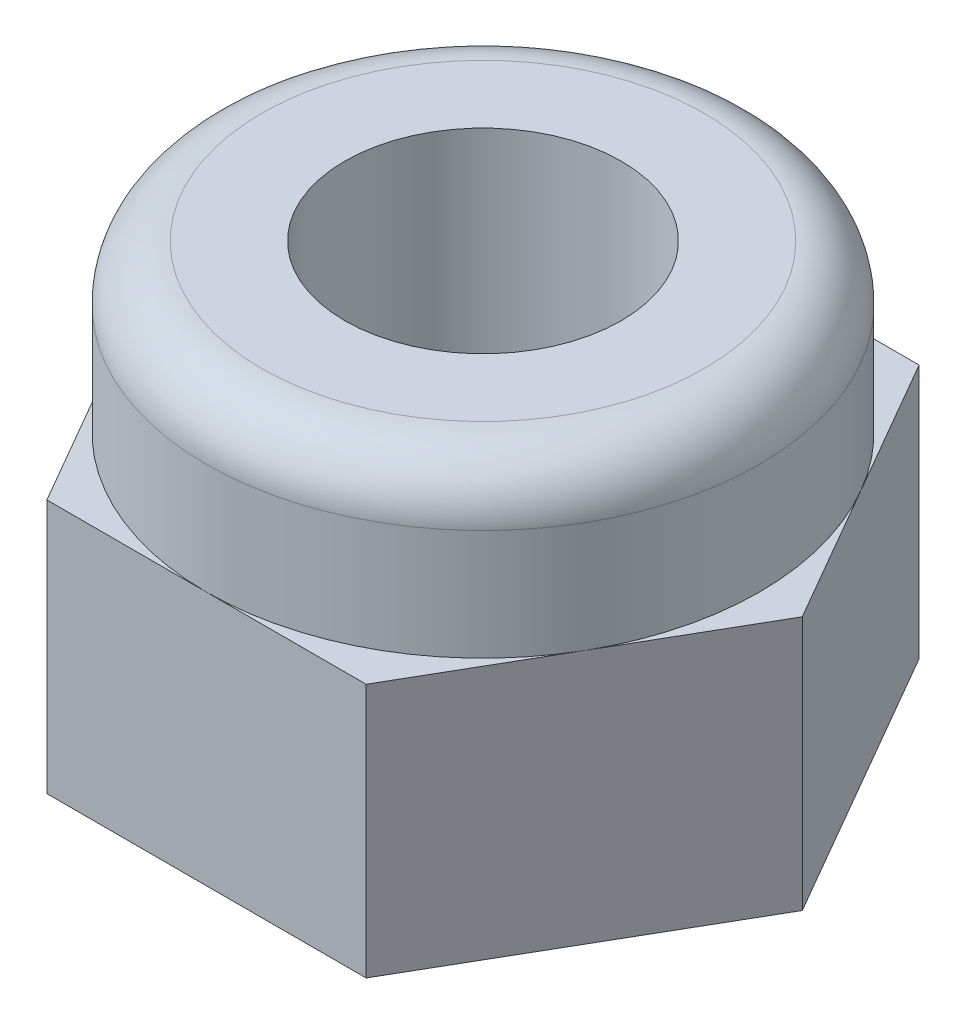
ISO-10303-21;
HEADER;
FILE_DESCRIPTION(('STEP AP214'),'2;1');
FILE_NAME('part.step','',(''),(''),'','','');
FILE_SCHEMA(('AUTOMOTIVE_DESIGN { 1 0 10303 214 1 1 1 1 }'));
ENDSEC;
DATA;
#1=APPLICATION_CONTEXT('core data for automotive mechanical design processes');
#2=APPLICATION_PROTOCOL_DEFINITION('international standard','automotive_design',2000,#1);
#3=PRODUCT_CONTEXT('',#1,'mechanical');
#4=PRODUCT('Part','Part','',(#3));
#5=PRODUCT_RELATED_PRODUCT_CATEGORY('part','',(#4));
#6=PRODUCT_DEFINITION_FORMATION('','',#4);
#7=PRODUCT_DEFINITION_CONTEXT('part definition',#1,'design');
#8=PRODUCT_DEFINITION('design','',#6,#7);
#9=PRODUCT_DEFINITION_SHAPE('','',#8);
#10=(LENGTH_UNIT() NAMED_UNIT(*) SI_UNIT(.MILLI.,.METRE.));
#11=(NAMED_UNIT(*) PLANE_ANGLE_UNIT() SI_UNIT($,.RADIAN.));
#12=(NAMED_UNIT(*) SI_UNIT($,.STERADIAN.) SOLID_ANGLE_UNIT());
#13=UNCERTAINTY_MEASURE_WITH_UNIT(LENGTH_MEASURE(1.E-05),#10,'distance_accuracy_value','');
#14=(GEOMETRIC_REPRESENTATION_CONTEXT(3) GLOBAL_UNCERTAINTY_ASSIGNED_CONTEXT((#13)) GLOBAL_UNIT_ASSIGNED_CONTEXT((#10,
#11,#12)) REPRESENTATION_CONTEXT('',''));
#15=CARTESIAN_POINT('',(0.,0.,0.));
#16=DIRECTION('',(0.,0.,1.));
#17=DIRECTION('',(1.,0.,0.));
#18=AXIS2_PLACEMENT_3D('',#15,#16,#17);
#19=CARTESIAN_POINT('',(0.,2.3,0.));
#20=DIRECTION('',(0.,1.,0.));
#21=DIRECTION('',(0.,0.,1.));
#22=AXIS2_PLACEMENT_3D('',#19,#20,#21);
#23=PLANE('',#22);
#24=CARTESIAN_POINT('',(0.,2.3,0.));
#25=DIRECTION('',(0.,1.,0.));
#26=DIRECTION('',(0.,0.,1.));
#27=AXIS2_PLACEMENT_3D('',#24,#25,#26);
#28=CIRCLE('',#27,2.5);
#29=CARTESIAN_POINT('',(0.,2.3,2.5));
#30=VERTEX_POINT('',#29);
#31=CARTESIAN_POINT('',(2.1650635094611,2.3,1.25));
#32=VERTEX_POINT('',#31);
#33=EDGE_CURVE('E123',#30,#32,#28,.T.);
#34=ORIENTED_EDGE('',*,*,#33,.F.);
#35=DIRECTION('',(1.,0.,0.));
#36=VECTOR('',#35,1.);
#37=CARTESIAN_POINT('',(-1.44337567297406,2.3,2.5));
#38=LINE('',#37,#36);
#39=CARTESIAN_POINT('',(1.44337567297407,2.3,2.5));
#40=VERTEX_POINT('',#39);
#41=EDGE_CURVE('E112',#30,#40,#38,.T.);
#42=ORIENTED_EDGE('',*,*,#41,.T.);
#43=DIRECTION('',(0.5,0.,-0.866025403784439));
#44=VECTOR('',#43,1.);
#45=CARTESIAN_POINT('',(1.44337567297407,2.3,2.5));
#46=LINE('',#45,#44);
#47=EDGE_CURVE('E124',#40,#32,#46,.T.);
#48=ORIENTED_EDGE('',*,*,#47,.T.);
#49=EDGE_LOOP('',(#34,#42,#48));
#50=FACE_BOUND('',#49,.T.);
#51=ADVANCED_FACE('F34',(#50),#23,.T.);
#52=CARTESIAN_POINT('',(2.1650635094611,2.3,-1.25));
#53=VERTEX_POINT('',#52);
#54=EDGE_CURVE('E130',#32,#53,#28,.T.);
#55=ORIENTED_EDGE('',*,*,#54,.F.);
#56=CARTESIAN_POINT('',(2.88675134594813,2.3,0.));
#57=VERTEX_POINT('',#56);
#58=EDGE_CURVE('E145',#32,#57,#46,.T.);
#59=ORIENTED_EDGE('',*,*,#58,.T.);
#60=DIRECTION('',(-0.5,0.,-0.866025403784439));
#61=VECTOR('',#60,1.);
#62=CARTESIAN_POINT('',(2.88675134594813,2.3,0.));
#63=LINE('',#62,#61);
#64=EDGE_CURVE('E146',#57,#53,#63,.T.);
#65=ORIENTED_EDGE('',*,*,#64,.T.);
#66=EDGE_LOOP('',(#55,#59,#65));
#67=FACE_BOUND('',#66,.T.);
#68=ADVANCED_FACE('F224',(#67),#23,.T.);
#69=CARTESIAN_POINT('',(0.,2.3,-2.5));
#70=VERTEX_POINT('',#69);
#71=EDGE_CURVE('E183',#53,#70,#28,.T.);
#72=ORIENTED_EDGE('',*,*,#71,.F.);
#73=CARTESIAN_POINT('',(1.44337567297406,2.3,-2.5));
#74=VERTEX_POINT('',#73);
#75=EDGE_CURVE('E144',#53,#74,#63,.T.);
#76=ORIENTED_EDGE('',*,*,#75,.T.);
#77=DIRECTION('',(-1.,0.,0.));
#78=VECTOR('',#77,1.);
#79=CARTESIAN_POINT('',(1.44337567297406,2.3,-2.5));
#80=LINE('',#79,#78);
#81=EDGE_CURVE('E150',#74,#70,#80,.T.);
#82=ORIENTED_EDGE('',*,*,#81,.T.);
#83=EDGE_LOOP('',(#72,#76,#82));
#84=FACE_BOUND('',#83,.T.);
#85=ADVANCED_FACE('F194',(#84),#23,.T.);
#86=CARTESIAN_POINT('',(-2.1650635094611,2.3,-1.25));
#87=VERTEX_POINT('',#86);
#88=EDGE_CURVE('E134',#70,#87,#28,.T.);
#89=ORIENTED_EDGE('',*,*,#88,.F.);
#90=CARTESIAN_POINT('',(-1.44337567297406,2.3,-2.5));
#91=VERTEX_POINT('',#90);
#92=EDGE_CURVE('E149',#70,#91,#80,.T.);
#93=ORIENTED_EDGE('',*,*,#92,.T.);
#94=DIRECTION('',(-0.5,0.,0.866025403784439));
#95=VECTOR('',#94,1.);
#96=CARTESIAN_POINT('',(-1.44337567297406,2.3,-2.5));
#97=LINE('',#96,#95);
#98=EDGE_CURVE('E154',#91,#87,#97,.T.);
#99=ORIENTED_EDGE('',*,*,#98,.T.);
#100=EDGE_LOOP('',(#89,#93,#99));
#101=FACE_BOUND('',#100,.T.);
#102=ADVANCED_FACE('F187',(#101),#23,.T.);
#103=CARTESIAN_POINT('',(-2.1650635094611,2.3,1.25));
#104=VERTEX_POINT('',#103);
#105=EDGE_CURVE('E57',#87,#104,#28,.T.);
#106=ORIENTED_EDGE('',*,*,#105,.F.);
#107=CARTESIAN_POINT('',(-2.88675134594813,2.3,0.));
#108=VERTEX_POINT('',#107);
#109=EDGE_CURVE('E153',#87,#108,#97,.T.);
#110=ORIENTED_EDGE('',*,*,#109,.T.);
#111=DIRECTION('',(0.5,0.,0.866025403784439));
#112=VECTOR('',#111,1.);
#113=CARTESIAN_POINT('',(-2.88675134594813,2.3,0.));
#114=LINE('',#113,#112);
#115=EDGE_CURVE('E121',#108,#104,#114,.T.);
#116=ORIENTED_EDGE('',*,*,#115,.T.);
#117=EDGE_LOOP('',(#106,#110,#116));
#118=FACE_BOUND('',#117,.T.);
#119=ADVANCED_FACE('F214',(#118),#23,.T.);
#120=EDGE_CURVE('E49',#104,#30,#28,.T.);
#121=ORIENTED_EDGE('',*,*,#120,.F.);
#122=CARTESIAN_POINT('',(-1.44337567297406,2.3,2.5));
#123=VERTEX_POINT('',#122);
#124=EDGE_CURVE('E107',#104,#123,#114,.T.);
#125=ORIENTED_EDGE('',*,*,#124,.T.);
#126=EDGE_CURVE('E104',#123,#30,#38,.T.);
#127=ORIENTED_EDGE('',*,*,#126,.T.);
#128=EDGE_LOOP('',(#121,#125,#127));
#129=FACE_BOUND('',#128,.T.);
#130=ADVANCED_FACE('F106',(#129),#23,.T.);
#131=CARTESIAN_POINT('',(0.,0.,0.));
#132=DIRECTION('',(0.,1.,0.));
#133=DIRECTION('',(0.,0.,1.));
#134=AXIS2_PLACEMENT_3D('',#131,#132,#133);
#135=PLANE('',#134);
#136=DIRECTION('',(0.5,0.,-0.866025403784439));
#137=VECTOR('',#136,1.);
#138=CARTESIAN_POINT('',(1.44337567297407,0.,2.5));
#139=LINE('',#138,#137);
#140=CARTESIAN_POINT('',(1.44337567297407,0.,2.5));
#141=VERTEX_POINT('',#140);
#142=CARTESIAN_POINT('',(2.88675134594813,0.,0.));
#143=VERTEX_POINT('',#142);
#144=EDGE_CURVE('E142',#141,#143,#139,.T.);
#145=ORIENTED_EDGE('',*,*,#144,.F.);
#146=DIRECTION('',(1.,0.,0.));
#147=VECTOR('',#146,1.);
#148=CARTESIAN_POINT('',(-1.44337567297406,0.,2.5));
#149=LINE('',#148,#147);
#150=CARTESIAN_POINT('',(-1.44337567297406,0.,2.5));
#151=VERTEX_POINT('',#150);
#152=EDGE_CURVE('E168',#151,#141,#149,.T.);
#153=ORIENTED_EDGE('',*,*,#152,.F.);
#154=DIRECTION('',(0.5,0.,0.866025403784439));
#155=VECTOR('',#154,1.);
#156=CARTESIAN_POINT('',(-2.88675134594813,0.,0.));
#157=LINE('',#156,#155);
#158=CARTESIAN_POINT('',(-2.88675134594813,0.,0.));
#159=VERTEX_POINT('',#158);
#160=EDGE_CURVE('E166',#159,#151,#157,.T.);
#161=ORIENTED_EDGE('',*,*,#160,.F.);
#162=DIRECTION('',(-0.5,0.,0.866025403784439));
#163=VECTOR('',#162,1.);
#164=CARTESIAN_POINT('',(-1.44337567297406,0.,-2.5));
#165=LINE('',#164,#163);
#166=CARTESIAN_POINT('',(-1.44337567297406,0.,-2.5));
#167=VERTEX_POINT('',#166);
#168=EDGE_CURVE('E164',#167,#159,#165,.T.);
#169=ORIENTED_EDGE('',*,*,#168,.F.);
#170=DIRECTION('',(-1.,0.,0.));
#171=VECTOR('',#170,1.);
#172=CARTESIAN_POINT('',(1.44337567297406,0.,-2.5));
#173=LINE('',#172,#171);
#174=CARTESIAN_POINT('',(1.44337567297406,0.,-2.5));
#175=VERTEX_POINT('',#174);
#176=EDGE_CURVE('E162',#175,#167,#173,.T.);
#177=ORIENTED_EDGE('',*,*,#176,.F.);
#178=DIRECTION('',(-0.5,0.,-0.866025403784439));
#179=VECTOR('',#178,1.);
#180=CARTESIAN_POINT('',(2.88675134594813,0.,0.));
#181=LINE('',#180,#179);
#182=EDGE_CURVE('E160',#143,#175,#181,.T.);
#183=ORIENTED_EDGE('',*,*,#182,.F.);
#184=EDGE_LOOP('',(#145,#153,#161,#169,#177,#183));
#185=FACE_BOUND('',#184,.T.);
#186=CARTESIAN_POINT('',(0.,0.,0.));
#187=DIRECTION('',(0.,1.,0.));
#188=DIRECTION('',(0.,0.,1.));
#189=AXIS2_PLACEMENT_3D('',#186,#187,#188);
#190=CIRCLE('',#189,1.25);
#191=CARTESIAN_POINT('',(0.,0.,1.25));
#192=VERTEX_POINT('',#191);
#193=EDGE_CURVE('E127',#192,#192,#190,.T.);
#194=ORIENTED_EDGE('',*,*,#193,.T.);
#195=EDGE_LOOP('',(#194));
#196=FACE_BOUND('',#195,.T.);
#197=ADVANCED_FACE('F204',(#185,#196),#135,.F.);
#198=CARTESIAN_POINT('',(1.44337567297407,2.3,2.5));
#199=DIRECTION('',(-0.866025403784439,0.,-0.5));
#200=DIRECTION('',(-0.5,0.,0.866025403784439));
#201=AXIS2_PLACEMENT_3D('',#198,#199,#200);
#202=PLANE('',#201);
#203=ORIENTED_EDGE('',*,*,#144,.T.);
#204=DIRECTION('',(0.,-1.,0.));
#205=VECTOR('',#204,1.);
#206=CARTESIAN_POINT('',(2.88675134594813,2.3,0.));
#207=LINE('',#206,#205);
#208=EDGE_CURVE('E133',#57,#143,#207,.T.);
#209=ORIENTED_EDGE('',*,*,#208,.F.);
#210=ORIENTED_EDGE('',*,*,#58,.F.);
#211=ORIENTED_EDGE('',*,*,#47,.F.);
#212=DIRECTION('',(0.,-1.,0.));
#213=VECTOR('',#212,1.);
#214=CARTESIAN_POINT('',(1.44337567297407,2.3,2.5));
#215=LINE('',#214,#213);
#216=EDGE_CURVE('E111',#40,#141,#215,.T.);
#217=ORIENTED_EDGE('',*,*,#216,.T.);
#218=EDGE_LOOP('',(#203,#209,#210,#211,#217));
#219=FACE_BOUND('',#218,.T.);
#220=ADVANCED_FACE('F235',(#219),#202,.F.);
#221=CARTESIAN_POINT('',(2.88675134594813,2.3,0.));
#222=DIRECTION('',(-0.866025403784439,0.,0.5));
#223=DIRECTION('',(0.5,0.,0.866025403784438));
#224=AXIS2_PLACEMENT_3D('',#221,#222,#223);
#225=PLANE('',#224);
#226=ORIENTED_EDGE('',*,*,#182,.T.);
#227=DIRECTION('',(0.,-1.,0.));
#228=VECTOR('',#227,1.);
#229=CARTESIAN_POINT('',(1.44337567297406,2.3,-2.5));
#230=LINE('',#229,#228);
#231=EDGE_CURVE('E136',#74,#175,#230,.T.);
#232=ORIENTED_EDGE('',*,*,#231,.F.);
#233=ORIENTED_EDGE('',*,*,#75,.F.);
#234=ORIENTED_EDGE('',*,*,#64,.F.);
#235=ORIENTED_EDGE('',*,*,#208,.T.);
#236=EDGE_LOOP('',(#226,#232,#233,#234,#235));
#237=FACE_BOUND('',#236,.T.);
#238=ADVANCED_FACE('F199',(#237),#225,.F.);
#239=CARTESIAN_POINT('',(1.44337567297406,2.3,-2.5));
#240=DIRECTION('',(0.,0.,1.));
#241=DIRECTION('',(1.,0.,0.));
#242=AXIS2_PLACEMENT_3D('',#239,#240,#241);
#243=PLANE('',#242);
#244=ORIENTED_EDGE('',*,*,#176,.T.);
#245=DIRECTION('',(0.,-1.,0.));
#246=VECTOR('',#245,1.);
#247=CARTESIAN_POINT('',(-1.44337567297406,2.3,-2.5));
#248=LINE('',#247,#246);
#249=EDGE_CURVE('E176',#91,#167,#248,.T.);
#250=ORIENTED_EDGE('',*,*,#249,.F.);
#251=ORIENTED_EDGE('',*,*,#92,.F.);
#252=ORIENTED_EDGE('',*,*,#81,.F.);
#253=ORIENTED_EDGE('',*,*,#231,.T.);
#254=EDGE_LOOP('',(#244,#250,#251,#252,#253));
#255=FACE_BOUND('',#254,.T.);
#256=ADVANCED_FACE('F192',(#255),#243,.F.);
#257=CARTESIAN_POINT('',(-1.44337567297406,2.3,-2.5));
#258=DIRECTION('',(0.866025403784439,0.,0.5));
#259=DIRECTION('',(0.5,0.,-0.866025403784439));
#260=AXIS2_PLACEMENT_3D('',#257,#258,#259);
#261=PLANE('',#260);
#262=ORIENTED_EDGE('',*,*,#168,.T.);
#263=DIRECTION('',(0.,-1.,0.));
#264=VECTOR('',#263,1.);
#265=CARTESIAN_POINT('',(-2.88675134594813,2.3,0.));
#266=LINE('',#265,#264);
#267=EDGE_CURVE('E173',#108,#159,#266,.T.);
#268=ORIENTED_EDGE('',*,*,#267,.F.);
#269=ORIENTED_EDGE('',*,*,#109,.F.);
#270=ORIENTED_EDGE('',*,*,#98,.F.);
#271=ORIENTED_EDGE('',*,*,#249,.T.);
#272=EDGE_LOOP('',(#262,#268,#269,#270,#271));
#273=FACE_BOUND('',#272,.T.);
#274=ADVANCED_FACE('F210',(#273),#261,.F.);
#275=CARTESIAN_POINT('',(-2.88675134594813,2.3,0.));
#276=DIRECTION('',(0.866025403784439,0.,-0.5));
#277=DIRECTION('',(-0.5,0.,-0.866025403784439));
#278=AXIS2_PLACEMENT_3D('',#275,#276,#277);
#279=PLANE('',#278);
#280=ORIENTED_EDGE('',*,*,#160,.T.);
#281=DIRECTION('',(0.,-1.,0.));
#282=VECTOR('',#281,1.);
#283=CARTESIAN_POINT('',(-1.44337567297406,2.3,2.5));
#284=LINE('',#283,#282);
#285=EDGE_CURVE('E171',#123,#151,#284,.T.);
#286=ORIENTED_EDGE('',*,*,#285,.F.);
#287=ORIENTED_EDGE('',*,*,#124,.F.);
#288=ORIENTED_EDGE('',*,*,#115,.F.);
#289=ORIENTED_EDGE('',*,*,#267,.T.);
#290=EDGE_LOOP('',(#280,#286,#287,#288,#289));
#291=FACE_BOUND('',#290,.T.);
#292=ADVANCED_FACE('F213',(#291),#279,.F.);
#293=CARTESIAN_POINT('',(-1.44337567297406,2.3,2.5));
#294=DIRECTION('',(0.,0.,-1.));
#295=DIRECTION('',(-1.,0.,0.));
#296=AXIS2_PLACEMENT_3D('',#293,#294,#295);
#297=PLANE('',#296);
#298=ORIENTED_EDGE('',*,*,#152,.T.);
#299=ORIENTED_EDGE('',*,*,#216,.F.);
#300=ORIENTED_EDGE('',*,*,#41,.F.);
#301=ORIENTED_EDGE('',*,*,#126,.F.);
#302=ORIENTED_EDGE('',*,*,#285,.T.);
#303=EDGE_LOOP('',(#298,#299,#300,#301,#302));
#304=FACE_BOUND('',#303,.T.);
#305=ADVANCED_FACE('F116',(#304),#297,.F.);
#306=CARTESIAN_POINT('',(0.,2.3,0.));
#307=DIRECTION('',(0.,-1.,0.));
#308=DIRECTION('',(0.,0.,-1.));
#309=AXIS2_PLACEMENT_3D('',#306,#307,#308);
#310=CYLINDRICAL_SURFACE('',#309,1.25);
#311=ORIENTED_EDGE('',*,*,#193,.F.);
#312=EDGE_LOOP('',(#311));
#313=FACE_BOUND('',#312,.T.);
#314=CARTESIAN_POINT('',(0.,3.8,0.));
#315=DIRECTION('',(0.,1.,0.));
#316=DIRECTION('',(0.,0.,1.));
#317=AXIS2_PLACEMENT_3D('',#314,#315,#316);
#318=CIRCLE('',#317,1.25);
#319=CARTESIAN_POINT('',(0.,3.8,1.25));
#320=VERTEX_POINT('',#319);
#321=EDGE_CURVE('E128',#320,#320,#318,.T.);
#322=ORIENTED_EDGE('',*,*,#321,.T.);
#323=EDGE_LOOP('',(#322));
#324=FACE_BOUND('',#323,.T.);
#325=ADVANCED_FACE('F250',(#313,#324),#310,.F.);
#326=CARTESIAN_POINT('',(0.,3.8,0.));
#327=DIRECTION('',(0.,1.,0.));
#328=DIRECTION('',(0.,0.,1.));
#329=AXIS2_PLACEMENT_3D('',#326,#327,#328);
#330=PLANE('',#329);
#331=CARTESIAN_POINT('',(0.,3.8,0.));
#332=DIRECTION('',(0.,1.,0.));
#333=DIRECTION('',(0.,0.,1.));
#334=AXIS2_PLACEMENT_3D('',#331,#332,#333);
#335=CIRCLE('',#334,2.);
#336=CARTESIAN_POINT('',(0.,3.8,2.));
#337=VERTEX_POINT('',#336);
#338=EDGE_CURVE('E42',#337,#337,#335,.T.);
#339=ORIENTED_EDGE('',*,*,#338,.T.);
#340=EDGE_LOOP('',(#339));
#341=FACE_BOUND('',#340,.T.);
#342=ORIENTED_EDGE('',*,*,#321,.F.);
#343=EDGE_LOOP('',(#342));
#344=FACE_BOUND('',#343,.T.);
#345=ADVANCED_FACE('F254',(#341,#344),#330,.T.);
#346=CARTESIAN_POINT('',(0.,3.8,0.));
#347=DIRECTION('',(0.,-1.,0.));
#348=DIRECTION('',(0.,0.,-1.));
#349=AXIS2_PLACEMENT_3D('',#346,#347,#348);
#350=CYLINDRICAL_SURFACE('',#349,2.5);
#351=CARTESIAN_POINT('',(0.,3.3,0.));
#352=DIRECTION('',(0.,1.,0.));
#353=DIRECTION('',(0.,0.,1.));
#354=AXIS2_PLACEMENT_3D('',#351,#352,#353);
#355=CIRCLE('',#354,2.5);
#356=CARTESIAN_POINT('',(0.,3.3,2.5));
#357=VERTEX_POINT('',#356);
#358=EDGE_CURVE('E11',#357,#357,#355,.F.);
#359=ORIENTED_EDGE('',*,*,#358,.T.);
#360=EDGE_LOOP('',(#359));
#361=FACE_BOUND('',#360,.T.);
#362=ORIENTED_EDGE('',*,*,#33,.T.);
#363=ORIENTED_EDGE('',*,*,#54,.T.);
#364=ORIENTED_EDGE('',*,*,#71,.T.);
#365=ORIENTED_EDGE('',*,*,#88,.T.);
#366=ORIENTED_EDGE('',*,*,#105,.T.);
#367=ORIENTED_EDGE('',*,*,#120,.T.);
#368=EDGE_LOOP('',(#362,#363,#364,#365,#366,#367));
#369=FACE_BOUND('',#368,.T.);
#370=ADVANCED_FACE('F131',(#361,#369),#350,.T.);
#371=CARTESIAN_POINT('',(0.,3.3,0.));
#372=DIRECTION('',(0.,1.,0.));
#373=DIRECTION('',(0.,0.,1.));
#374=AXIS2_PLACEMENT_3D('',#371,#372,#373);
#375=TOROIDAL_SURFACE('',#374,2.,0.5);
#376=ORIENTED_EDGE('',*,*,#358,.F.);
#377=EDGE_LOOP('',(#376));
#378=FACE_BOUND('',#377,.T.);
#379=ORIENTED_EDGE('',*,*,#338,.F.);
#380=EDGE_LOOP('',(#379));
#381=FACE_BOUND('',#380,.T.);
#382=ADVANCED_FACE('F36',(#378,#381),#375,.T.);
#383=CLOSED_SHELL('',(#51,#68,#85,#102,#119,#130,#197,#220,#238,#256,#274,#292,#305,#325,#345,
#370,#382));
#384=MANIFOLD_SOLID_BREP('B2',#383);
#385=ADVANCED_BREP_SHAPE_REPRESENTATION('',(#18,#384),#14);
#386=SHAPE_DEFINITION_REPRESENTATION(#9,#385);
ENDSEC;
END-ISO-10303-21;
